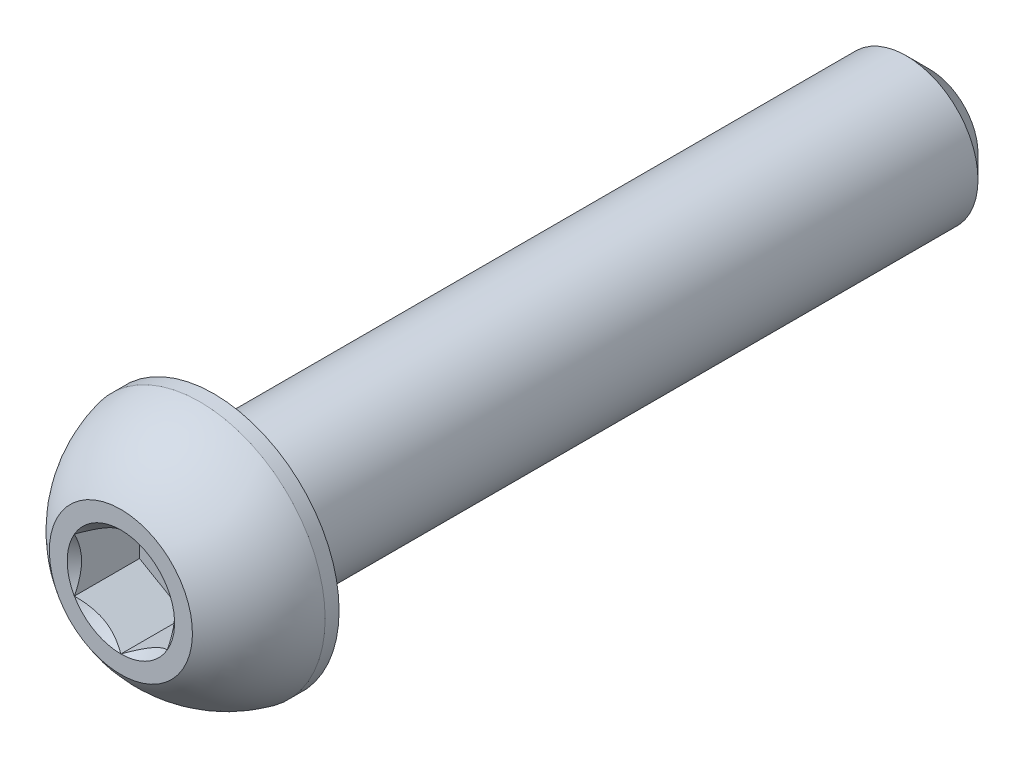
ISO-10303-21;
HEADER;
FILE_DESCRIPTION(('STEP AP214'),'2;1');
FILE_NAME('part.step','',(''),(''),'','','');
FILE_SCHEMA(('AUTOMOTIVE_DESIGN { 1 0 10303 214 1 1 1 1 }'));
ENDSEC;
DATA;
#1=APPLICATION_CONTEXT('core data for automotive mechanical design processes');
#2=APPLICATION_PROTOCOL_DEFINITION('international standard','automotive_design',2000,#1);
#3=PRODUCT_CONTEXT('',#1,'mechanical');
#4=PRODUCT('Part','Part','',(#3));
#5=PRODUCT_RELATED_PRODUCT_CATEGORY('part','',(#4));
#6=PRODUCT_DEFINITION_FORMATION('','',#4);
#7=PRODUCT_DEFINITION_CONTEXT('part definition',#1,'design');
#8=PRODUCT_DEFINITION('design','',#6,#7);
#9=PRODUCT_DEFINITION_SHAPE('','',#8);
#10=(LENGTH_UNIT() NAMED_UNIT(*) SI_UNIT(.MILLI.,.METRE.));
#11=(NAMED_UNIT(*) PLANE_ANGLE_UNIT() SI_UNIT($,.RADIAN.));
#12=(NAMED_UNIT(*) SI_UNIT($,.STERADIAN.) SOLID_ANGLE_UNIT());
#13=UNCERTAINTY_MEASURE_WITH_UNIT(LENGTH_MEASURE(1.E-05),#10,'distance_accuracy_value','');
#14=(GEOMETRIC_REPRESENTATION_CONTEXT(3) GLOBAL_UNCERTAINTY_ASSIGNED_CONTEXT((#13)) GLOBAL_UNIT_ASSIGNED_CONTEXT((#10,
#11,#12)) REPRESENTATION_CONTEXT('',''));
#15=CARTESIAN_POINT('',(0.,0.,0.));
#16=DIRECTION('',(0.,0.,1.));
#17=DIRECTION('',(1.,0.,0.));
#18=AXIS2_PLACEMENT_3D('',#15,#16,#17);
#19=CARTESIAN_POINT('',(0.,0.,5.65));
#20=DIRECTION('',(0.,0.,-1.));
#21=DIRECTION('',(-1.,0.,0.));
#22=AXIS2_PLACEMENT_3D('',#19,#20,#21);
#23=PLANE('',#22);
#24=CARTESIAN_POINT('',(0.,0.,5.65));
#25=DIRECTION('',(0.,0.,1.));
#26=DIRECTION('',(1.,0.,0.));
#27=AXIS2_PLACEMENT_3D('',#24,#25,#26);
#28=CIRCLE('',#27,0.750555349946514);
#29=CARTESIAN_POINT('',(-0.65,0.375277674973257,5.65));
#30=VERTEX_POINT('',#29);
#31=CARTESIAN_POINT('',(-0.65,-0.375277674973257,5.65));
#32=VERTEX_POINT('',#31);
#33=EDGE_CURVE('E132',#30,#32,#28,.T.);
#34=ORIENTED_EDGE('',*,*,#33,.F.);
#35=CARTESIAN_POINT('',(0.,0.750555349946514,5.65));
#36=VERTEX_POINT('',#35);
#37=EDGE_CURVE('E104',#36,#30,#28,.T.);
#38=ORIENTED_EDGE('',*,*,#37,.F.);
#39=CARTESIAN_POINT('',(0.65,0.375277674973257,5.65));
#40=VERTEX_POINT('',#39);
#41=EDGE_CURVE('E95',#40,#36,#28,.T.);
#42=ORIENTED_EDGE('',*,*,#41,.F.);
#43=CARTESIAN_POINT('',(0.65,-0.375277674973256,5.65));
#44=VERTEX_POINT('',#43);
#45=EDGE_CURVE('E56',#44,#40,#28,.T.);
#46=ORIENTED_EDGE('',*,*,#45,.F.);
#47=CARTESIAN_POINT('',(0.,-0.750555349946513,5.65));
#48=VERTEX_POINT('',#47);
#49=EDGE_CURVE('E63',#48,#44,#28,.T.);
#50=ORIENTED_EDGE('',*,*,#49,.F.);
#51=EDGE_CURVE('E133',#32,#48,#28,.T.);
#52=ORIENTED_EDGE('',*,*,#51,.F.);
#53=EDGE_LOOP('',(#34,#38,#42,#46,#50,#52));
#54=FACE_BOUND('',#53,.T.);
#55=CARTESIAN_POINT('',(0.,0.,5.65));
#56=DIRECTION('',(0.,0.,1.));
#57=DIRECTION('',(1.,0.,0.));
#58=AXIS2_PLACEMENT_3D('',#55,#56,#57);
#59=CIRCLE('',#58,0.999999999999998);
#60=CARTESIAN_POINT('',(0.,0.999999999999999,5.65));
#61=VERTEX_POINT('',#60);
#62=EDGE_CURVE('E50',#61,#61,#59,.T.);
#63=ORIENTED_EDGE('',*,*,#62,.T.);
#64=EDGE_LOOP('',(#63));
#65=FACE_BOUND('',#64,.T.);
#66=ADVANCED_FACE('F37',(#54,#65),#23,.F.);
#67=CARTESIAN_POINT('',(0.,0.,4.16424208144796));
#68=DIRECTION('',(0.,0.,1.));
#69=DIRECTION('',(0.,1.,0.));
#70=AXIS2_PLACEMENT_3D('',#67,#68,#69);
#71=SPHERICAL_SURFACE('',#70,1.790942933915);
#72=CARTESIAN_POINT('',(0.,0.,4.545));
#73=DIRECTION('',(0.,0.,1.));
#74=DIRECTION('',(1.,0.,0.));
#75=AXIS2_PLACEMENT_3D('',#72,#73,#74);
#76=CIRCLE('',#75,1.75);
#77=CARTESIAN_POINT('',(0.,1.75,4.545));
#78=VERTEX_POINT('',#77);
#79=EDGE_CURVE('E215',#78,#78,#76,.T.);
#80=CARTESIAN_POINT('',(0.,0.999999999999999,5.65));
#81=CARTESIAN_POINT('',(0.,1.01182643004196,5.6420401786267));
#82=CARTESIAN_POINT('',(0.,1.02355778185812,5.63393909660818));
#83=CARTESIAN_POINT('',(0.,1.04682372823726,5.61745915548289));
#84=CARTESIAN_POINT('',(0.,1.05835832280024,5.60908029637612));
#85=CARTESIAN_POINT('',(0.,1.08122415387148,5.59204954527651));
#86=CARTESIAN_POINT('',(0.,1.09255539037974,5.58339765328368));
#87=CARTESIAN_POINT('',(0.,1.11500805055768,5.56582577873956));
#88=CARTESIAN_POINT('',(0.,1.12612947422737,5.55690579618827));
#89=CARTESIAN_POINT('',(0.,1.14815616552583,5.53880282434977));
#90=CARTESIAN_POINT('',(0.,1.15906143315459,5.52961983506254));
#91=CARTESIAN_POINT('',(0.,1.18064959458057,5.51099608658973));
#92=CARTESIAN_POINT('',(0.,1.1913324883778,5.50155532740413));
#93=CARTESIAN_POINT('',(0.,1.21246981057064,5.48242142213754));
#94=CARTESIAN_POINT('',(0.,1.22292423896625,5.47272827605655));
#95=CARTESIAN_POINT('',(0.,1.24359866921302,5.45309512413341));
#96=CARTESIAN_POINT('',(0.,1.25381867106419,5.44315511829125));
#97=CARTESIAN_POINT('',(0.,1.2740184207091,5.42303391468225));
#98=CARTESIAN_POINT('',(0.,1.28399816850284,5.4128527169154));
#99=CARTESIAN_POINT('',(0.,1.30371171952532,5.39225493483821));
#100=CARTESIAN_POINT('',(0.,1.31344552275404,5.38183835052787));
#101=CARTESIAN_POINT('',(0.,1.33266163437492,5.36077573495947));
#102=CARTESIAN_POINT('',(0.,1.34214394276706,5.3501297037014));
#103=CARTESIAN_POINT('',(0.,1.36085165784782,5.32861426466644));
#104=CARTESIAN_POINT('',(0.,1.37007706453643,5.31774485688953));
#105=CARTESIAN_POINT('',(0.,1.38826571582979,5.29578886261602));
#106=CARTESIAN_POINT('',(0.,1.39722896043454,5.28470227611942));
#107=CARTESIAN_POINT('',(0.,1.41488817666623,5.26231824604234));
#108=CARTESIAN_POINT('',(0.,1.42358414829318,5.25102080246184));
#109=CARTESIAN_POINT('',(0.,1.44070386007592,5.22822150008468));
#110=CARTESIAN_POINT('',(0.,1.44912760023172,5.216719641288));
#111=CARTESIAN_POINT('',(0.,1.46569804580677,5.19351806690492));
#112=CARTESIAN_POINT('',(0.,1.47384475122603,5.18181835131851));
#113=CARTESIAN_POINT('',(0.,1.48985648202944,5.15822773460149));
#114=CARTESIAN_POINT('',(0.,1.49772150741358,5.14633683347089));
#115=CARTESIAN_POINT('',(0.,1.51316539346376,5.12237062592612));
#116=CARTESIAN_POINT('',(0.,1.5207442541298,5.11029531951196));
#117=CARTESIAN_POINT('',(0.,1.53561148923355,5.08596718680969));
#118=CARTESIAN_POINT('',(0.,1.54289986367127,5.07371436052158));
#119=CARTESIAN_POINT('',(0.,1.5571819704451,5.04903817470386));
#120=CARTESIAN_POINT('',(0.,1.56417570278122,5.03661481517425));
#121=CARTESIAN_POINT('',(0.,1.57786453748518,5.01160464674505));
#122=CARTESIAN_POINT('',(0.,1.58455963985302,4.99901783784545));
#123=CARTESIAN_POINT('',(0.,1.59764739703439,4.97368794774754));
#124=CARTESIAN_POINT('',(0.,1.60404005184792,4.96094486654925));
#125=CARTESIAN_POINT('',(0.,1.61651926879161,4.93530969803253));
#126=CARTESIAN_POINT('',(0.,1.62260583092176,4.92241761071411));
#127=CARTESIAN_POINT('',(0.,1.63446939190682,4.89649178110021));
#128=CARTESIAN_POINT('',(0.,1.64024639076172,4.88345803880473));
#129=CARTESIAN_POINT('',(0.,1.65148753111412,4.85725633115103));
#130=CARTESIAN_POINT('',(0.,1.65695167261162,4.84408836579282));
#131=CARTESIAN_POINT('',(0.,1.66756398257888,4.81762572046728));
#132=CARTESIAN_POINT('',(0.,1.67271215104863,4.80433104049997));
#133=CARTESIAN_POINT('',(0.,1.68268957938988,4.77762254664633));
#134=CARTESIAN_POINT('',(0.,1.68751883926138,4.76420873276001));
#135=CARTESIAN_POINT('',(0.,1.69685569693965,4.73726961975255));
#136=CARTESIAN_POINT('',(0.,1.70136329474644,4.7237443206314));
#137=CARTESIAN_POINT('',(0.,1.71005425727009,4.696589949172));
#138=CARTESIAN_POINT('',(0.,1.71423762198697,4.68296087683374));
#139=CARTESIAN_POINT('',(0.,1.72227773581392,4.65560673101066));
#140=CARTESIAN_POINT('',(0.,1.72613448492398,4.64188165752584));
#141=CARTESIAN_POINT('',(0.,1.73351915771601,4.61434333293355));
#142=CARTESIAN_POINT('',(0.,1.73704708139798,4.60053008182609));
#143=CARTESIAN_POINT('',(0.,1.74377213155194,4.57282328805928));
#144=CARTESIAN_POINT('',(0.,1.74696925802394,4.55892974539993));
#145=CARTESIAN_POINT('',(0.,1.75,4.545));
#146=B_SPLINE_CURVE_WITH_KNOTS('',3,(#80,#81,#82,#83,#84,#85,#86,#87,#88,#89,#90,#91,#92,#93,
#94,#95,#96,#97,#98,#99,#100,#101,#102,#103,#104,#105,#106,#107,#108,#109,#110,#111,#112,#113,
#114,#115,#116,#117,#118,#119,#120,#121,#122,#123,#124,#125,#126,#127,#128,#129,#130,#131,#132,
#133,#134,#135,#136,#137,#138,#139,#140,#141,#142,#143,#144,#145),.UNSPECIFIED.,.F.,.F.,(4,2,2,
2,2,2,2,2,2,2,2,2,2,2,2,2,2,2,2,2,2,2,2,2,2,2,2,2,2,2,2,2,4),(0.,0.0427658943058258,
0.085531788611652,0.128297682917478,0.171063577223304,0.21382947152913,0.256595365834956,
0.299361260140782,0.342127154446609,0.384893048752435,0.427658943058261,0.470424837364086,
0.513190731669912,0.555956625975738,0.598722520281565,0.641488414587391,0.684254308893216,
0.727020203199043,0.769786097504869,0.812551991810695,0.855317886116521,0.898083780422347,
0.940849674728174,0.983615569034,1.02638146333983,1.06914735764565,1.11191325195148,
1.1546791462573,1.19744504056313,1.24021093486896,1.28297682917478,1.32574272348061,
1.36850861778643),.UNSPECIFIED.);
#147=EDGE_CURVE('BSEAM220',#61,#78,#146,.T.);
#148=ORIENTED_EDGE('',*,*,#62,.F.);
#149=ORIENTED_EDGE('',*,*,#79,.T.);
#150=ORIENTED_EDGE('',*,*,#147,.T.);
#151=ORIENTED_EDGE('',*,*,#147,.F.);
#152=EDGE_LOOP('',(#148,#150,#149,#151));
#153=FACE_BOUND('',#152,.T.);
#154=ADVANCED_FACE('F220',(#153),#71,.T.);
#155=CARTESIAN_POINT('',(0.,0.,5.65));
#156=DIRECTION('',(0.,0.,1.));
#157=DIRECTION('',(1.,0.,0.));
#158=AXIS2_PLACEMENT_3D('',#155,#156,#157);
#159=CYLINDRICAL_SURFACE('',#158,1.75);
#160=ORIENTED_EDGE('',*,*,#79,.F.);
#161=EDGE_LOOP('',(#160));
#162=FACE_BOUND('',#161,.T.);
#163=CARTESIAN_POINT('',(0.,0.,4.35));
#164=DIRECTION('',(0.,0.,1.));
#165=DIRECTION('',(1.,0.,0.));
#166=AXIS2_PLACEMENT_3D('',#163,#164,#165);
#167=CIRCLE('',#166,1.75);
#168=CARTESIAN_POINT('',(1.75,0.,4.35));
#169=VERTEX_POINT('',#168);
#170=EDGE_CURVE('E212',#169,#169,#167,.T.);
#171=ORIENTED_EDGE('',*,*,#170,.T.);
#172=EDGE_LOOP('',(#171));
#173=FACE_BOUND('',#172,.T.);
#174=ADVANCED_FACE('F223',(#162,#173),#159,.T.);
#175=CARTESIAN_POINT('',(0.,0.999999999999998,4.35));
#176=DIRECTION('',(0.,0.,1.));
#177=DIRECTION('',(1.,0.,0.));
#178=AXIS2_PLACEMENT_3D('',#175,#176,#177);
#179=PLANE('',#178);
#180=ORIENTED_EDGE('',*,*,#170,.F.);
#181=EDGE_LOOP('',(#180));
#182=FACE_BOUND('',#181,.T.);
#183=CARTESIAN_POINT('',(0.,0.,4.35));
#184=DIRECTION('',(0.,0.,1.));
#185=DIRECTION('',(1.,0.,0.));
#186=AXIS2_PLACEMENT_3D('',#183,#184,#185);
#187=CIRCLE('',#186,0.999999999999997);
#188=CARTESIAN_POINT('',(0.999999999999997,0.,4.35));
#189=VERTEX_POINT('',#188);
#190=EDGE_CURVE('E209',#189,#189,#187,.T.);
#191=ORIENTED_EDGE('',*,*,#190,.T.);
#192=EDGE_LOOP('',(#191));
#193=FACE_BOUND('',#192,.T.);
#194=ADVANCED_FACE('F228',(#182,#193),#179,.F.);
#195=CARTESIAN_POINT('',(0.,0.,5.65));
#196=DIRECTION('',(0.,0.,1.));
#197=DIRECTION('',(1.,0.,0.));
#198=AXIS2_PLACEMENT_3D('',#195,#196,#197);
#199=CYLINDRICAL_SURFACE('',#198,0.999999999999997);
#200=ORIENTED_EDGE('',*,*,#190,.F.);
#201=EDGE_LOOP('',(#200));
#202=FACE_BOUND('',#201,.T.);
#203=CARTESIAN_POINT('',(0.,0.,-5.33));
#204=DIRECTION('',(0.,0.,1.));
#205=DIRECTION('',(1.,0.,0.));
#206=AXIS2_PLACEMENT_3D('',#203,#204,#205);
#207=CIRCLE('',#206,0.999999999999998);
#208=CARTESIAN_POINT('',(0.999999999999998,0.,-5.33));
#209=VERTEX_POINT('',#208);
#210=EDGE_CURVE('E206',#209,#209,#207,.T.);
#211=ORIENTED_EDGE('',*,*,#210,.T.);
#212=EDGE_LOOP('',(#211));
#213=FACE_BOUND('',#212,.T.);
#214=ADVANCED_FACE('F234',(#202,#213),#199,.T.);
#215=CARTESIAN_POINT('',(0.,0.,-5.65));
#216=DIRECTION('',(0.,0.,1.));
#217=DIRECTION('',(1.,0.,0.));
#218=AXIS2_PLACEMENT_3D('',#215,#216,#217);
#219=CONICAL_SURFACE('',#218,0.679999999999999,0.785398163397445);
#220=ORIENTED_EDGE('',*,*,#210,.F.);
#221=EDGE_LOOP('',(#220));
#222=FACE_BOUND('',#221,.T.);
#223=CARTESIAN_POINT('',(0.,0.,-5.65));
#224=DIRECTION('',(0.,0.,1.));
#225=DIRECTION('',(1.,0.,0.));
#226=AXIS2_PLACEMENT_3D('',#223,#224,#225);
#227=CIRCLE('',#226,0.679999999999999);
#228=CARTESIAN_POINT('',(0.679999999999999,0.,-5.65));
#229=VERTEX_POINT('',#228);
#230=EDGE_CURVE('E193',#229,#229,#227,.T.);
#231=ORIENTED_EDGE('',*,*,#230,.T.);
#232=EDGE_LOOP('',(#231));
#233=FACE_BOUND('',#232,.T.);
#234=ADVANCED_FACE('F240',(#222,#233),#219,.T.);
#235=CARTESIAN_POINT('',(0.,0.,-5.65));
#236=DIRECTION('',(0.,0.,1.));
#237=DIRECTION('',(1.,0.,0.));
#238=AXIS2_PLACEMENT_3D('',#235,#236,#237);
#239=PLANE('',#238);
#240=ORIENTED_EDGE('',*,*,#230,.F.);
#241=EDGE_LOOP('',(#240));
#242=FACE_BOUND('',#241,.T.);
#243=ADVANCED_FACE('F166',(#242),#239,.F.);
#244=CARTESIAN_POINT('',(0.,0.,5.65));
#245=DIRECTION('',(0.,0.,1.));
#246=DIRECTION('',(1.,0.,0.));
#247=AXIS2_PLACEMENT_3D('',#244,#245,#246);
#248=CONICAL_SURFACE('',#247,0.750555349946514,0.78539816339745);
#249=ORIENTED_EDGE('',*,*,#37,.T.);
#250=CARTESIAN_POINT('',(0.000199999999999804,0.750670820000352,5.65011549669667));
#251=CARTESIAN_POINT('',(-0.0221538754426207,0.737764803996123,5.63721736219154));
#252=CARTESIAN_POINT('',(-0.0448801205326127,0.724643800275747,5.62507515489864));
#253=CARTESIAN_POINT('',(-0.0912219846432828,0.697888312556703,5.60284224486223));
#254=CARTESIAN_POINT('',(-0.114842019040597,0.684251279339145,5.59276392481001));
#255=CARTESIAN_POINT('',(-0.162473808706857,0.656751052753347,5.57550151642337));
#256=CARTESIAN_POINT('',(-0.186473364593087,0.642894902702,5.56827395851558));
#257=CARTESIAN_POINT('',(-0.23498941024521,0.614884150684731,5.55712920200001));
#258=CARTESIAN_POINT('',(-0.259504444041882,0.600730389323029,5.55320370262187));
#259=CARTESIAN_POINT('',(-0.319384402335921,0.566158679282902,5.54822343733471));
#260=CARTESIAN_POINT('',(-0.354889192903236,0.545659978891342,5.54912448479266));
#261=CARTESIAN_POINT('',(-0.425154552317995,0.505092254718525,5.55840856131667));
#262=CARTESIAN_POINT('',(-0.459913930439302,0.485023918403324,5.56680276302966));
#263=CARTESIAN_POINT('',(-0.52095826250894,0.449779956850418,5.5870456785073));
#264=CARTESIAN_POINT('',(-0.547523861415086,0.434442301170771,5.5978384232645));
#265=CARTESIAN_POINT('',(-0.599614154899067,0.404367956205628,5.6221519314496));
#266=CARTESIAN_POINT('',(-0.625141918825036,0.38962949483116,5.63566382100729));
#267=CARTESIAN_POINT('',(-0.6502,0.375162204919419,5.65011549669667));
#268=B_SPLINE_CURVE_WITH_KNOTS('',3,(#250,#251,#252,#253,#254,#255,#256,#257,#258,#259,#260,
#261,#262,#263,#264,#265,#266,#267),.UNSPECIFIED.,.F.,.F.,(4,2,2,2,2,2,2,2,4),(0.,
0.0866236559063445,0.173752711623243,0.259496442803569,0.345023980281753,0.467267720550126,
0.589694037029337,0.687111308755481,0.784215671813666),.UNSPECIFIED.);
#269=EDGE_CURVE('E11',#36,#30,#268,.T.);
#270=ORIENTED_EDGE('',*,*,#269,.F.);
#271=EDGE_LOOP('',(#249,#270));
#272=FACE_BOUND('',#271,.T.);
#273=ADVANCED_FACE('F108',(#272),#248,.F.);
#274=ORIENTED_EDGE('',*,*,#33,.T.);
#275=CARTESIAN_POINT('',(-0.65,-0.748456856202,5.89075069038401));
#276=CARTESIAN_POINT('',(-0.65,-0.711991073878822,5.86328028593362));
#277=CARTESIAN_POINT('',(-0.65,-0.6751396400828,5.8362651954762));
#278=CARTESIAN_POINT('',(-0.65,-0.600031183452824,5.78362934828316));
#279=CARTESIAN_POINT('',(-0.65,-0.561765441270898,5.7580211061291));
#280=CARTESIAN_POINT('',(-0.65,-0.481525479406323,5.70773749376246));
#281=CARTESIAN_POINT('',(-0.65,-0.439464253670488,5.68319880219875));
#282=CARTESIAN_POINT('',(-0.65,-0.353242719412721,5.63831465969864));
#283=CARTESIAN_POINT('',(-0.65,-0.309090130602526,5.61795507248949));
#284=CARTESIAN_POINT('',(-0.65,-0.24281005749867,5.59304872908865));
#285=CARTESIAN_POINT('',(-0.65,-0.22166734982169,5.58590072741471));
#286=CARTESIAN_POINT('',(-0.65,-0.178882845085543,5.57329752945255));
#287=CARTESIAN_POINT('',(-0.65,-0.157241013753964,5.56784244978312));
#288=CARTESIAN_POINT('',(-0.65,-0.0924732258239351,5.55466076531022));
#289=CARTESIAN_POINT('',(-0.65,-0.0486986201802782,5.54979355976944));
#290=CARTESIAN_POINT('',(-0.65,0.0373331587621233,5.54914448923078));
#291=CARTESIAN_POINT('',(-0.65,0.0795879418799263,5.5530403393198));
#292=CARTESIAN_POINT('',(-0.65,0.142230570834974,5.56449232559783));
#293=CARTESIAN_POINT('',(-0.65,0.163174856664668,5.56931456423673));
#294=CARTESIAN_POINT('',(-0.65,0.204615212735413,5.58060009995474));
#295=CARTESIAN_POINT('',(-0.65,0.225111320324616,5.58706325972014));
#296=CARTESIAN_POINT('',(-0.65,0.28963853477237,5.60984409213164));
#297=CARTESIAN_POINT('',(-0.65,0.33274820687505,5.6287572451342));
#298=CARTESIAN_POINT('',(-0.65,0.416943840013233,5.67081128188878));
#299=CARTESIAN_POINT('',(-0.65,0.458021834530769,5.69396735475778));
#300=CARTESIAN_POINT('',(-0.65,0.536529233245988,5.74172663971809));
#301=CARTESIAN_POINT('',(-0.65,0.57403850913462,5.76620075812715));
#302=CARTESIAN_POINT('',(-0.65,0.647609691485456,5.81662345601488));
#303=CARTESIAN_POINT('',(-0.65,0.683680924535918,5.84255834365529));
#304=CARTESIAN_POINT('',(-0.65,0.71935620475114,5.86896687739743));
#305=B_SPLINE_CURVE_WITH_KNOTS('',3,(#275,#276,#277,#278,#279,#280,#281,#282,#283,#284,#285,
#286,#287,#288,#289,#290,#291,#292,#293,#294,#295,#296,#297,#298,#299,#300,#301,#302,#303,#304),
.UNSPECIFIED.,.F.,.F.,(4,2,2,2,2,2,2,2,2,2,2,2,2,2,4),(0.,0.13701403000958,0.275096405762554,
0.421060359835526,0.566522128775094,0.633415056462921,0.700312591121805,0.83153492450834,
0.958010408789903,1.02242898521266,1.08684217280829,1.22766018796413,1.36899252873704,
1.50330165960873,1.63651263433843),.UNSPECIFIED.);
#306=EDGE_CURVE('E103',#30,#32,#305,.F.);
#307=ORIENTED_EDGE('',*,*,#306,.F.);
#308=EDGE_LOOP('',(#274,#307));
#309=FACE_BOUND('',#308,.T.);
#310=ADVANCED_FACE('F252',(#309),#248,.F.);
#311=ORIENTED_EDGE('',*,*,#51,.T.);
#312=CARTESIAN_POINT('',(-0.6502,-0.375162204919418,5.65011549669667));
#313=CARTESIAN_POINT('',(-0.627846124557379,-0.388068220923647,5.63721736219154));
#314=CARTESIAN_POINT('',(-0.605119879467387,-0.401189224644023,5.62507515489864));
#315=CARTESIAN_POINT('',(-0.558778015356717,-0.427944712363067,5.60284224486222));
#316=CARTESIAN_POINT('',(-0.535157980959403,-0.441581745580625,5.59276392481001));
#317=CARTESIAN_POINT('',(-0.487526191293144,-0.469081972166423,5.57550151642337));
#318=CARTESIAN_POINT('',(-0.463526635406913,-0.48293812221777,5.56827395851558));
#319=CARTESIAN_POINT('',(-0.41501058975479,-0.51094887423504,5.557129202));
#320=CARTESIAN_POINT('',(-0.390495555958118,-0.525102635596741,5.55320370262187));
#321=CARTESIAN_POINT('',(-0.330615597664079,-0.559674345636868,5.54822343733471));
#322=CARTESIAN_POINT('',(-0.295110807096764,-0.580173046028428,5.54912448479266));
#323=CARTESIAN_POINT('',(-0.224845447682005,-0.620740770201245,5.55840856131667));
#324=CARTESIAN_POINT('',(-0.190086069560698,-0.640809106516446,5.56680276302965));
#325=CARTESIAN_POINT('',(-0.12904173749106,-0.676053068069352,5.5870456785073));
#326=CARTESIAN_POINT('',(-0.102476138584914,-0.691390723748999,5.5978384232645));
#327=CARTESIAN_POINT('',(-0.0503858451009331,-0.721465068714142,5.6221519314496));
#328=CARTESIAN_POINT('',(-0.0248580811749642,-0.73620353008861,5.63566382100729));
#329=CARTESIAN_POINT('',(0.000200000000000108,-0.750670820000351,5.65011549669667));
#330=B_SPLINE_CURVE_WITH_KNOTS('',3,(#312,#313,#314,#315,#316,#317,#318,#319,#320,#321,#322,
#323,#324,#325,#326,#327,#328,#329),.UNSPECIFIED.,.F.,.F.,(4,2,2,2,2,2,2,2,4),(0.,
0.0866236559063447,0.173752711623243,0.259496442803569,0.345023980281753,0.467267720550126,
0.589694037029336,0.687111308755481,0.784215671813666),.UNSPECIFIED.);
#331=EDGE_CURVE('E142',#32,#48,#330,.T.);
#332=ORIENTED_EDGE('',*,*,#331,.F.);
#333=EDGE_LOOP('',(#311,#332));
#334=FACE_BOUND('',#333,.T.);
#335=ADVANCED_FACE('F354',(#334),#248,.F.);
#336=ORIENTED_EDGE('',*,*,#49,.T.);
#337=CARTESIAN_POINT('',(-0.000200000000000003,-0.750670820000351,5.65011549669667));
#338=CARTESIAN_POINT('',(0.0221538754426205,-0.737764803996122,5.63721736219154));
#339=CARTESIAN_POINT('',(0.0448801205326124,-0.724643800275746,5.62507515489864));
#340=CARTESIAN_POINT('',(0.091221984643282,-0.697888312556702,5.60284224486222));
#341=CARTESIAN_POINT('',(0.114842019040596,-0.684251279339145,5.59276392481001));
#342=CARTESIAN_POINT('',(0.162473808706855,-0.656751052753346,5.57550151642337));
#343=CARTESIAN_POINT('',(0.186473364593085,-0.642894902702,5.56827395851558));
#344=CARTESIAN_POINT('',(0.234989410245208,-0.614884150684731,5.557129202));
#345=CARTESIAN_POINT('',(0.259504444041879,-0.60073038932303,5.55320370262187));
#346=CARTESIAN_POINT('',(0.319384402335918,-0.566158679282903,5.54822343733471));
#347=CARTESIAN_POINT('',(0.354889192903233,-0.545659978891342,5.54912448479266));
#348=CARTESIAN_POINT('',(0.425154552317992,-0.505092254718525,5.55840856131667));
#349=CARTESIAN_POINT('',(0.459913930439299,-0.485023918403325,5.56680276302966));
#350=CARTESIAN_POINT('',(0.520958262508937,-0.449779956850418,5.5870456785073));
#351=CARTESIAN_POINT('',(0.547523861415084,-0.434442301170771,5.5978384232645));
#352=CARTESIAN_POINT('',(0.599614154899066,-0.404367956205628,5.6221519314496));
#353=CARTESIAN_POINT('',(0.625141918825035,-0.38962949483116,5.63566382100729));
#354=CARTESIAN_POINT('',(0.6502,-0.375162204919419,5.65011549669667));
#355=B_SPLINE_CURVE_WITH_KNOTS('',3,(#337,#338,#339,#340,#341,#342,#343,#344,#345,#346,#347,
#348,#349,#350,#351,#352,#353,#354),.UNSPECIFIED.,.F.,.F.,(4,2,2,2,2,2,2,2,4),(0.,
0.0866236559063442,0.173752711623242,0.259496442803567,0.345023980281751,0.467267720550123,
0.589694037029333,0.687111308755479,0.784215671813665),.UNSPECIFIED.);
#356=EDGE_CURVE('E343',#48,#44,#355,.T.);
#357=ORIENTED_EDGE('',*,*,#356,.F.);
#358=EDGE_LOOP('',(#336,#357));
#359=FACE_BOUND('',#358,.T.);
#360=ADVANCED_FACE('F355',(#359),#248,.F.);
#361=ORIENTED_EDGE('',*,*,#45,.T.);
#362=CARTESIAN_POINT('',(0.65,-0.748456856310897,5.89075069046623));
#363=CARTESIAN_POINT('',(0.65,-0.711991073981599,5.86328028600952));
#364=CARTESIAN_POINT('',(0.65,-0.675139640179433,5.83626519554577));
#365=CARTESIAN_POINT('',(0.65,-0.600031183536871,5.78362934834011));
#366=CARTESIAN_POINT('',(0.65,-0.561765441348501,5.75802110617975));
#367=CARTESIAN_POINT('',(0.65,-0.481525479469872,5.70773749380016));
#368=CARTESIAN_POINT('',(0.65,-0.439464253726391,5.68319880222984));
#369=CARTESIAN_POINT('',(0.65,-0.35324271945268,5.63831465971746));
#370=CARTESIAN_POINT('',(0.65,-0.309090130634193,5.61795507250266));
#371=CARTESIAN_POINT('',(0.65,-0.242810057524099,5.59304872909763));
#372=CARTESIAN_POINT('',(0.65,-0.221667349849732,5.58590072742385));
#373=CARTESIAN_POINT('',(0.65,-0.178882845118893,5.57329752946148));
#374=CARTESIAN_POINT('',(0.65,-0.157241013790008,5.5678424497917));
#375=CARTESIAN_POINT('',(0.65,-0.0924732258678794,5.55466076531677));
#376=CARTESIAN_POINT('',(0.65,-0.0486986202294706,5.54979355977344));
#377=CARTESIAN_POINT('',(0.65,0.0373331587036342,5.54914448922772));
#378=CARTESIAN_POINT('',(0.65,0.0795879418173605,5.55304033931236));
#379=CARTESIAN_POINT('',(0.65,0.142230570766795,5.5644923255833));
#380=CARTESIAN_POINT('',(0.65,0.163174856594624,5.5693145642197));
#381=CARTESIAN_POINT('',(0.65,0.204615212661818,5.58060009993267));
#382=CARTESIAN_POINT('',(0.65,0.225111320249333,5.58706325969551));
#383=CARTESIAN_POINT('',(0.65,0.289638534680692,5.60984409209498));
#384=CARTESIAN_POINT('',(0.65,0.332748206769488,5.62875724508647));
#385=CARTESIAN_POINT('',(0.65,0.41694383988097,5.67081128181769));
#386=CARTESIAN_POINT('',(0.65,0.458021834385694,5.69396735467439));
#387=CARTESIAN_POINT('',(0.65,0.536529233077877,5.74172663961117));
#388=CARTESIAN_POINT('',(0.65,0.574038508956202,5.76620075800911));
#389=CARTESIAN_POINT('',(0.65,0.647609691286781,5.81662345587469));
#390=CARTESIAN_POINT('',(0.65,0.683680924327292,5.84255834350407));
#391=CARTESIAN_POINT('',(0.65,0.719356204532568,5.86896687723526));
#392=B_SPLINE_CURVE_WITH_KNOTS('',3,(#362,#363,#364,#365,#366,#367,#368,#369,#370,#371,#372,
#373,#374,#375,#376,#377,#378,#379,#380,#381,#382,#383,#384,#385,#386,#387,#388,#389,#390,#391),
.UNSPECIFIED.,.F.,.F.,(4,2,2,2,2,2,2,2,2,2,2,2,2,2,4),(0.,0.137014030035661,0.275096405815206,
0.421060359917976,0.566522128887061,0.633415056567334,0.700312591218677,0.831534924590809,
0.958010408859154,1.02242898527478,1.08684217286327,1.22766018796786,1.36899252868916,
1.50330165951672,1.63651263420287),.UNSPECIFIED.);
#393=EDGE_CURVE('E120',#44,#40,#392,.T.);
#394=ORIENTED_EDGE('',*,*,#393,.F.);
#395=EDGE_LOOP('',(#361,#394));
#396=FACE_BOUND('',#395,.T.);
#397=ADVANCED_FACE('F357',(#396),#248,.F.);
#398=ORIENTED_EDGE('',*,*,#41,.T.);
#399=CARTESIAN_POINT('',(0.6502,0.375162204919419,5.65011549669667));
#400=CARTESIAN_POINT('',(0.62784612455738,0.388068220923647,5.63721736219154));
#401=CARTESIAN_POINT('',(0.605119879467388,0.401189224644023,5.62507515489864));
#402=CARTESIAN_POINT('',(0.558778015356718,0.427944712363068,5.60284224486223));
#403=CARTESIAN_POINT('',(0.535157980959403,0.441581745580625,5.59276392481001));
#404=CARTESIAN_POINT('',(0.487526191293144,0.469081972166424,5.57550151642337));
#405=CARTESIAN_POINT('',(0.463526635406914,0.48293812221777,5.56827395851558));
#406=CARTESIAN_POINT('',(0.415010589754791,0.51094887423504,5.55712920200001));
#407=CARTESIAN_POINT('',(0.39049555595812,0.525102635596741,5.55320370262187));
#408=CARTESIAN_POINT('',(0.330615597664081,0.559674345636868,5.54822343733471));
#409=CARTESIAN_POINT('',(0.295110807096766,0.580173046028428,5.54912448479266));
#410=CARTESIAN_POINT('',(0.224845447682006,0.620740770201245,5.55840856131667));
#411=CARTESIAN_POINT('',(0.190086069560699,0.640809106516446,5.56680276302966));
#412=CARTESIAN_POINT('',(0.129041737491061,0.676053068069352,5.5870456785073));
#413=CARTESIAN_POINT('',(0.102476138584915,0.691390723748999,5.5978384232645));
#414=CARTESIAN_POINT('',(0.0503858451009336,0.721465068714143,5.6221519314496));
#415=CARTESIAN_POINT('',(0.0248580811749642,0.73620353008861,5.63566382100729));
#416=CARTESIAN_POINT('',(-0.000200000000000343,0.750670820000352,5.65011549669667));
#417=B_SPLINE_CURVE_WITH_KNOTS('',3,(#399,#400,#401,#402,#403,#404,#405,#406,#407,#408,#409,
#410,#411,#412,#413,#414,#415,#416),.UNSPECIFIED.,.F.,.F.,(4,2,2,2,2,2,2,2,4),(0.,
0.0866236559063442,0.173752711623242,0.259496442803568,0.345023980281752,0.467267720550124,
0.589694037029335,0.68711130875548,0.784215671813666),.UNSPECIFIED.);
#418=EDGE_CURVE('E99',#40,#36,#417,.T.);
#419=ORIENTED_EDGE('',*,*,#418,.F.);
#420=EDGE_LOOP('',(#398,#419));
#421=FACE_BOUND('',#420,.T.);
#422=ADVANCED_FACE('F97',(#421),#248,.F.);
#423=CARTESIAN_POINT('',(0.,0.,4.74));
#424=DIRECTION('',(0.,0.,1.));
#425=DIRECTION('',(1.,0.,0.));
#426=AXIS2_PLACEMENT_3D('',#423,#424,#425);
#427=PLANE('',#426);
#428=DIRECTION('',(-0.866025403784439,0.5,0.));
#429=VECTOR('',#428,1.);
#430=CARTESIAN_POINT('',(0.65,0.375277674973257,4.74));
#431=LINE('',#430,#429);
#432=CARTESIAN_POINT('',(0.65,0.375277674973257,4.74));
#433=VERTEX_POINT('',#432);
#434=CARTESIAN_POINT('',(0.,0.750555349946514,4.74));
#435=VERTEX_POINT('',#434);
#436=EDGE_CURVE('E119',#433,#435,#431,.T.);
#437=ORIENTED_EDGE('',*,*,#436,.T.);
#438=DIRECTION('',(-0.866025403784439,-0.5,0.));
#439=VECTOR('',#438,1.);
#440=CARTESIAN_POINT('',(0.,0.750555349946514,4.74));
#441=LINE('',#440,#439);
#442=CARTESIAN_POINT('',(-0.65,0.375277674973257,4.74));
#443=VERTEX_POINT('',#442);
#444=EDGE_CURVE('E124',#435,#443,#441,.T.);
#445=ORIENTED_EDGE('',*,*,#444,.T.);
#446=DIRECTION('',(0.,-1.,0.));
#447=VECTOR('',#446,1.);
#448=CARTESIAN_POINT('',(-0.65,0.375277674973257,4.74));
#449=LINE('',#448,#447);
#450=CARTESIAN_POINT('',(-0.65,-0.375277674973256,4.74));
#451=VERTEX_POINT('',#450);
#452=EDGE_CURVE('E181',#443,#451,#449,.T.);
#453=ORIENTED_EDGE('',*,*,#452,.T.);
#454=DIRECTION('',(0.866025403784439,-0.5,0.));
#455=VECTOR('',#454,1.);
#456=CARTESIAN_POINT('',(-0.65,-0.375277674973256,4.74));
#457=LINE('',#456,#455);
#458=CARTESIAN_POINT('',(0.,-0.750555349946513,4.74));
#459=VERTEX_POINT('',#458);
#460=EDGE_CURVE('E184',#451,#459,#457,.T.);
#461=ORIENTED_EDGE('',*,*,#460,.T.);
#462=DIRECTION('',(0.866025403784439,0.5,0.));
#463=VECTOR('',#462,1.);
#464=CARTESIAN_POINT('',(0.,-0.750555349946513,4.74));
#465=LINE('',#464,#463);
#466=CARTESIAN_POINT('',(0.65,-0.375277674973256,4.74));
#467=VERTEX_POINT('',#466);
#468=EDGE_CURVE('E187',#459,#467,#465,.T.);
#469=ORIENTED_EDGE('',*,*,#468,.T.);
#470=DIRECTION('',(0.,1.,0.));
#471=VECTOR('',#470,1.);
#472=CARTESIAN_POINT('',(0.65,-0.375277674973256,4.74));
#473=LINE('',#472,#471);
#474=EDGE_CURVE('E127',#467,#433,#473,.T.);
#475=ORIENTED_EDGE('',*,*,#474,.T.);
#476=EDGE_LOOP('',(#437,#445,#453,#461,#469,#475));
#477=FACE_BOUND('',#476,.T.);
#478=ADVANCED_FACE('F161',(#477),#427,.T.);
#479=CARTESIAN_POINT('',(0.,0.750555349946514,4.74));
#480=DIRECTION('',(-0.5,0.866025403784439,0.));
#481=DIRECTION('',(-0.866025403784439,-0.5,0.));
#482=AXIS2_PLACEMENT_3D('',#479,#480,#481);
#483=PLANE('',#482);
#484=DIRECTION('',(0.,0.,1.));
#485=VECTOR('',#484,1.);
#486=CARTESIAN_POINT('',(0.,0.750555349946514,4.74));
#487=LINE('',#486,#485);
#488=EDGE_CURVE('E116',#435,#36,#487,.T.);
#489=ORIENTED_EDGE('',*,*,#488,.T.);
#490=ORIENTED_EDGE('',*,*,#269,.T.);
#491=DIRECTION('',(0.,0.,1.));
#492=VECTOR('',#491,1.);
#493=CARTESIAN_POINT('',(-0.65,0.375277674973257,4.74));
#494=LINE('',#493,#492);
#495=EDGE_CURVE('E126',#443,#30,#494,.T.);
#496=ORIENTED_EDGE('',*,*,#495,.F.);
#497=ORIENTED_EDGE('',*,*,#444,.F.);
#498=EDGE_LOOP('',(#489,#490,#496,#497));
#499=FACE_BOUND('',#498,.T.);
#500=ADVANCED_FACE('F122',(#499),#483,.F.);
#501=CARTESIAN_POINT('',(-0.65,0.375277674973257,4.74));
#502=DIRECTION('',(-1.,0.,0.));
#503=DIRECTION('',(0.,-1.,0.));
#504=AXIS2_PLACEMENT_3D('',#501,#502,#503);
#505=PLANE('',#504);
#506=ORIENTED_EDGE('',*,*,#495,.T.);
#507=ORIENTED_EDGE('',*,*,#306,.T.);
#508=DIRECTION('',(0.,0.,1.));
#509=VECTOR('',#508,1.);
#510=CARTESIAN_POINT('',(-0.65,-0.375277674973256,4.74));
#511=LINE('',#510,#509);
#512=EDGE_CURVE('E200',#451,#32,#511,.T.);
#513=ORIENTED_EDGE('',*,*,#512,.F.);
#514=ORIENTED_EDGE('',*,*,#452,.F.);
#515=EDGE_LOOP('',(#506,#507,#513,#514));
#516=FACE_BOUND('',#515,.T.);
#517=ADVANCED_FACE('F151',(#516),#505,.F.);
#518=CARTESIAN_POINT('',(-0.65,-0.375277674973256,4.74));
#519=DIRECTION('',(-0.5,-0.866025403784439,0.));
#520=DIRECTION('',(0.866025403784439,-0.5,0.));
#521=AXIS2_PLACEMENT_3D('',#518,#519,#520);
#522=PLANE('',#521);
#523=ORIENTED_EDGE('',*,*,#512,.T.);
#524=ORIENTED_EDGE('',*,*,#331,.T.);
#525=DIRECTION('',(0.,0.,1.));
#526=VECTOR('',#525,1.);
#527=CARTESIAN_POINT('',(0.,-0.750555349946513,4.74));
#528=LINE('',#527,#526);
#529=EDGE_CURVE('E197',#459,#48,#528,.T.);
#530=ORIENTED_EDGE('',*,*,#529,.F.);
#531=ORIENTED_EDGE('',*,*,#460,.F.);
#532=EDGE_LOOP('',(#523,#524,#530,#531));
#533=FACE_BOUND('',#532,.T.);
#534=ADVANCED_FACE('F154',(#533),#522,.F.);
#535=CARTESIAN_POINT('',(0.,-0.750555349946513,4.74));
#536=DIRECTION('',(0.5,-0.866025403784439,0.));
#537=DIRECTION('',(0.866025403784439,0.5,0.));
#538=AXIS2_PLACEMENT_3D('',#535,#536,#537);
#539=PLANE('',#538);
#540=ORIENTED_EDGE('',*,*,#529,.T.);
#541=ORIENTED_EDGE('',*,*,#356,.T.);
#542=DIRECTION('',(0.,0.,1.));
#543=VECTOR('',#542,1.);
#544=CARTESIAN_POINT('',(0.65,-0.375277674973256,4.74));
#545=LINE('',#544,#543);
#546=EDGE_CURVE('E194',#467,#44,#545,.T.);
#547=ORIENTED_EDGE('',*,*,#546,.F.);
#548=ORIENTED_EDGE('',*,*,#468,.F.);
#549=EDGE_LOOP('',(#540,#541,#547,#548));
#550=FACE_BOUND('',#549,.T.);
#551=ADVANCED_FACE('F311',(#550),#539,.F.);
#552=CARTESIAN_POINT('',(0.65,-0.375277674973256,4.74));
#553=DIRECTION('',(1.,0.,0.));
#554=DIRECTION('',(0.,1.,0.));
#555=AXIS2_PLACEMENT_3D('',#552,#553,#554);
#556=PLANE('',#555);
#557=ORIENTED_EDGE('',*,*,#546,.T.);
#558=ORIENTED_EDGE('',*,*,#393,.T.);
#559=DIRECTION('',(0.,0.,1.));
#560=VECTOR('',#559,1.);
#561=CARTESIAN_POINT('',(0.65,0.375277674973257,4.74));
#562=LINE('',#561,#560);
#563=EDGE_CURVE('E118',#433,#40,#562,.T.);
#564=ORIENTED_EDGE('',*,*,#563,.F.);
#565=ORIENTED_EDGE('',*,*,#474,.F.);
#566=EDGE_LOOP('',(#557,#558,#564,#565));
#567=FACE_BOUND('',#566,.T.);
#568=ADVANCED_FACE('F165',(#567),#556,.F.);
#569=CARTESIAN_POINT('',(0.65,0.375277674973257,4.74));
#570=DIRECTION('',(0.5,0.866025403784439,0.));
#571=DIRECTION('',(-0.866025403784439,0.5,0.));
#572=AXIS2_PLACEMENT_3D('',#569,#570,#571);
#573=PLANE('',#572);
#574=ORIENTED_EDGE('',*,*,#563,.T.);
#575=ORIENTED_EDGE('',*,*,#418,.T.);
#576=ORIENTED_EDGE('',*,*,#488,.F.);
#577=ORIENTED_EDGE('',*,*,#436,.F.);
#578=EDGE_LOOP('',(#574,#575,#576,#577));
#579=FACE_BOUND('',#578,.T.);
#580=ADVANCED_FACE('F114',(#579),#573,.F.);
#581=CLOSED_SHELL('',(#66,#154,#174,#194,#214,#234,#243,#273,#310,#335,#360,#397,#422,#478,#500,
#517,#534,#551,#568,#580));
#582=MANIFOLD_SOLID_BREP('B2',#581);
#583=ADVANCED_BREP_SHAPE_REPRESENTATION('',(#18,#582),#14);
#584=SHAPE_DEFINITION_REPRESENTATION(#9,#583);
ENDSEC;
END-ISO-10303-21;
